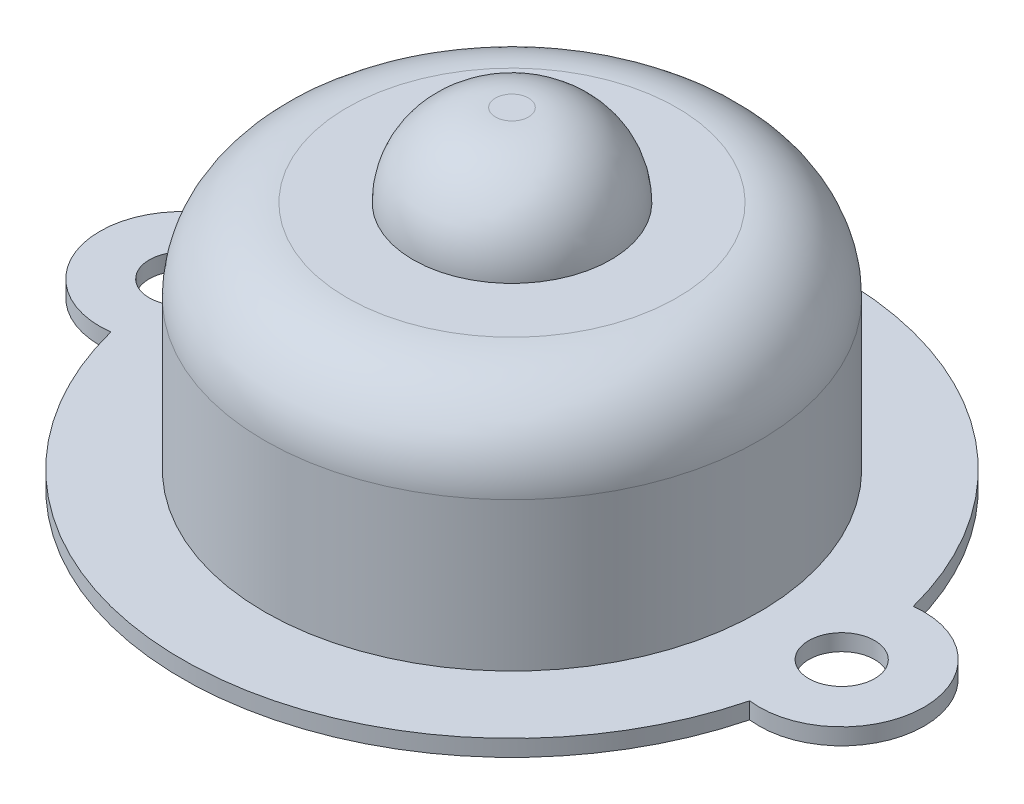
ISO-10303-21;
HEADER;
FILE_DESCRIPTION(('STEP AP214'),'2;1');
FILE_NAME('part.step','',(''),(''),'','','');
FILE_SCHEMA(('AUTOMOTIVE_DESIGN { 1 0 10303 214 1 1 1 1 }'));
ENDSEC;
DATA;
#1=APPLICATION_CONTEXT('core data for automotive mechanical design processes');
#2=APPLICATION_PROTOCOL_DEFINITION('international standard','automotive_design',2000,#1);
#3=PRODUCT_CONTEXT('',#1,'mechanical');
#4=PRODUCT('Part','Part','',(#3));
#5=PRODUCT_RELATED_PRODUCT_CATEGORY('part','',(#4));
#6=PRODUCT_DEFINITION_FORMATION('','',#4);
#7=PRODUCT_DEFINITION_CONTEXT('part definition',#1,'design');
#8=PRODUCT_DEFINITION('design','',#6,#7);
#9=PRODUCT_DEFINITION_SHAPE('','',#8);
#10=(LENGTH_UNIT() NAMED_UNIT(*) SI_UNIT(.MILLI.,.METRE.));
#11=(NAMED_UNIT(*) PLANE_ANGLE_UNIT() SI_UNIT($,.RADIAN.));
#12=(NAMED_UNIT(*) SI_UNIT($,.STERADIAN.) SOLID_ANGLE_UNIT());
#13=UNCERTAINTY_MEASURE_WITH_UNIT(LENGTH_MEASURE(1.E-05),#10,'distance_accuracy_value','');
#14=(GEOMETRIC_REPRESENTATION_CONTEXT(3) GLOBAL_UNCERTAINTY_ASSIGNED_CONTEXT((#13)) GLOBAL_UNIT_ASSIGNED_CONTEXT((#10,
#11,#12)) REPRESENTATION_CONTEXT('',''));
#15=CARTESIAN_POINT('',(0.,0.,0.));
#16=DIRECTION('',(0.,0.,1.));
#17=DIRECTION('',(1.,0.,0.));
#18=AXIS2_PLACEMENT_3D('',#15,#16,#17);
#19=CARTESIAN_POINT('',(0.,15.,0.));
#20=DIRECTION('',(0.,1.,0.));
#21=DIRECTION('',(0.,0.,1.));
#22=AXIS2_PLACEMENT_3D('',#19,#20,#21);
#23=PLANE('',#22);
#24=CARTESIAN_POINT('',(0.,15.,0.));
#25=DIRECTION('',(0.,1.,0.));
#26=DIRECTION('',(0.,0.,1.));
#27=AXIS2_PLACEMENT_3D('',#24,#25,#26);
#28=CIRCLE('',#27,10.);
#29=CARTESIAN_POINT('',(0.,15.,10.));
#30=VERTEX_POINT('',#29);
#31=EDGE_CURVE('E113',#30,#30,#28,.T.);
#32=ORIENTED_EDGE('',*,*,#31,.T.);
#33=EDGE_LOOP('',(#32));
#34=FACE_BOUND('',#33,.T.);
#35=CARTESIAN_POINT('',(0.,15.,0.));
#36=DIRECTION('',(0.,1.,0.));
#37=DIRECTION('',(0.,0.,1.));
#38=AXIS2_PLACEMENT_3D('',#35,#36,#37);
#39=CIRCLE('',#38,6.);
#40=CARTESIAN_POINT('',(0.,15.,6.));
#41=VERTEX_POINT('',#40);
#42=EDGE_CURVE('E132',#41,#41,#39,.T.);
#43=ORIENTED_EDGE('',*,*,#42,.F.);
#44=EDGE_LOOP('',(#43));
#45=FACE_BOUND('',#44,.T.);
#46=ADVANCED_FACE('F34',(#34,#45),#23,.T.);
#47=CARTESIAN_POINT('',(10.,1.,0.));
#48=DIRECTION('',(0.,1.,0.));
#49=DIRECTION('',(0.,0.,1.));
#50=AXIS2_PLACEMENT_3D('',#47,#48,#49);
#51=PLANE('',#50);
#52=CARTESIAN_POINT('',(20.,1.,0.));
#53=DIRECTION('',(0.,1.,0.));
#54=DIRECTION('',(0.,0.,1.));
#55=AXIS2_PLACEMENT_3D('',#52,#53,#54);
#56=CIRCLE('',#55,2.);
#57=CARTESIAN_POINT('',(20.,1.,2.));
#58=VERTEX_POINT('',#57);
#59=EDGE_CURVE('E140',#58,#58,#56,.T.);
#60=ORIENTED_EDGE('',*,*,#59,.F.);
#61=EDGE_LOOP('',(#60));
#62=FACE_BOUND('',#61,.T.);
#63=CARTESIAN_POINT('',(20.,1.,0.));
#64=DIRECTION('',(0.,1.,0.));
#65=DIRECTION('',(0.,0.,1.));
#66=AXIS2_PLACEMENT_3D('',#63,#64,#65);
#67=CIRCLE('',#66,5.);
#68=CARTESIAN_POINT('',(19.375,1.,4.96078370824611));
#69=VERTEX_POINT('',#68);
#70=CARTESIAN_POINT('',(19.375,1.,-4.96078370824611));
#71=VERTEX_POINT('',#70);
#72=EDGE_CURVE('E88',#69,#71,#67,.T.);
#73=ORIENTED_EDGE('',*,*,#72,.T.);
#74=CARTESIAN_POINT('',(0.,1.,0.));
#75=DIRECTION('',(0.,1.,0.));
#76=DIRECTION('',(0.,0.,1.));
#77=AXIS2_PLACEMENT_3D('',#74,#75,#76);
#78=CIRCLE('',#77,20.);
#79=CARTESIAN_POINT('',(-19.375,1.,-4.96078370824611));
#80=VERTEX_POINT('',#79);
#81=EDGE_CURVE('E82',#71,#80,#78,.T.);
#82=ORIENTED_EDGE('',*,*,#81,.T.);
#83=CARTESIAN_POINT('',(-20.,1.,0.));
#84=DIRECTION('',(0.,1.,0.));
#85=DIRECTION('',(0.,0.,1.));
#86=AXIS2_PLACEMENT_3D('',#83,#84,#85);
#87=CIRCLE('',#86,5.);
#88=CARTESIAN_POINT('',(-19.375,1.,4.96078370824611));
#89=VERTEX_POINT('',#88);
#90=EDGE_CURVE('E86',#80,#89,#87,.T.);
#91=ORIENTED_EDGE('',*,*,#90,.T.);
#92=CARTESIAN_POINT('',(0.,1.,0.));
#93=DIRECTION('',(0.,1.,0.));
#94=DIRECTION('',(0.,0.,1.));
#95=AXIS2_PLACEMENT_3D('',#92,#93,#94);
#96=CIRCLE('',#95,20.);
#97=EDGE_CURVE('E51',#89,#69,#96,.T.);
#98=ORIENTED_EDGE('',*,*,#97,.T.);
#99=EDGE_LOOP('',(#73,#82,#91,#98));
#100=FACE_BOUND('',#99,.T.);
#101=CARTESIAN_POINT('',(-20.,1.,0.));
#102=DIRECTION('',(0.,1.,0.));
#103=DIRECTION('',(0.,0.,1.));
#104=AXIS2_PLACEMENT_3D('',#101,#102,#103);
#105=CIRCLE('',#104,2.);
#106=CARTESIAN_POINT('',(-20.,1.,2.));
#107=VERTEX_POINT('',#106);
#108=EDGE_CURVE('E106',#107,#107,#105,.T.);
#109=ORIENTED_EDGE('',*,*,#108,.F.);
#110=EDGE_LOOP('',(#109));
#111=FACE_BOUND('',#110,.T.);
#112=CARTESIAN_POINT('',(0.,1.,0.));
#113=DIRECTION('',(0.,1.,0.));
#114=DIRECTION('',(0.,0.,1.));
#115=AXIS2_PLACEMENT_3D('',#112,#113,#114);
#116=CIRCLE('',#115,15.);
#117=CARTESIAN_POINT('',(0.,1.,15.));
#118=VERTEX_POINT('',#117);
#119=EDGE_CURVE('E134',#118,#118,#116,.T.);
#120=ORIENTED_EDGE('',*,*,#119,.F.);
#121=EDGE_LOOP('',(#120));
#122=FACE_BOUND('',#121,.T.);
#123=ADVANCED_FACE('F83',(#62,#100,#111,#122),#51,.T.);
#124=CARTESIAN_POINT('',(10.,0.,0.));
#125=DIRECTION('',(0.,1.,0.));
#126=DIRECTION('',(0.,0.,1.));
#127=AXIS2_PLACEMENT_3D('',#124,#125,#126);
#128=PLANE('',#127);
#129=CARTESIAN_POINT('',(-20.,0.,0.));
#130=DIRECTION('',(0.,1.,0.));
#131=DIRECTION('',(0.,0.,1.));
#132=AXIS2_PLACEMENT_3D('',#129,#130,#131);
#133=CIRCLE('',#132,2.);
#134=CARTESIAN_POINT('',(-20.,0.,2.));
#135=VERTEX_POINT('',#134);
#136=EDGE_CURVE('E143',#135,#135,#133,.T.);
#137=ORIENTED_EDGE('',*,*,#136,.T.);
#138=EDGE_LOOP('',(#137));
#139=FACE_BOUND('',#138,.T.);
#140=CARTESIAN_POINT('',(20.,0.,0.));
#141=DIRECTION('',(0.,1.,0.));
#142=DIRECTION('',(0.,0.,1.));
#143=AXIS2_PLACEMENT_3D('',#140,#141,#142);
#144=CIRCLE('',#143,5.);
#145=CARTESIAN_POINT('',(19.375,0.,4.96078370824611));
#146=VERTEX_POINT('',#145);
#147=CARTESIAN_POINT('',(19.375,0.,-4.96078370824611));
#148=VERTEX_POINT('',#147);
#149=EDGE_CURVE('E103',#146,#148,#144,.T.);
#150=ORIENTED_EDGE('',*,*,#149,.F.);
#151=CARTESIAN_POINT('',(0.,0.,0.));
#152=DIRECTION('',(0.,1.,0.));
#153=DIRECTION('',(0.,0.,1.));
#154=AXIS2_PLACEMENT_3D('',#151,#152,#153);
#155=CIRCLE('',#154,20.);
#156=CARTESIAN_POINT('',(-19.375,0.,4.96078370824611));
#157=VERTEX_POINT('',#156);
#158=EDGE_CURVE('E74',#157,#146,#155,.T.);
#159=ORIENTED_EDGE('',*,*,#158,.F.);
#160=CARTESIAN_POINT('',(-20.,0.,0.));
#161=DIRECTION('',(0.,1.,0.));
#162=DIRECTION('',(0.,0.,1.));
#163=AXIS2_PLACEMENT_3D('',#160,#161,#162);
#164=CIRCLE('',#163,5.);
#165=CARTESIAN_POINT('',(-19.375,0.,-4.96078370824611));
#166=VERTEX_POINT('',#165);
#167=EDGE_CURVE('E68',#166,#157,#164,.T.);
#168=ORIENTED_EDGE('',*,*,#167,.F.);
#169=CARTESIAN_POINT('',(0.,0.,0.));
#170=DIRECTION('',(0.,1.,0.));
#171=DIRECTION('',(0.,0.,1.));
#172=AXIS2_PLACEMENT_3D('',#169,#170,#171);
#173=CIRCLE('',#172,20.);
#174=EDGE_CURVE('E93',#148,#166,#173,.T.);
#175=ORIENTED_EDGE('',*,*,#174,.F.);
#176=EDGE_LOOP('',(#150,#159,#168,#175));
#177=FACE_BOUND('',#176,.T.);
#178=CARTESIAN_POINT('',(20.,0.,0.));
#179=DIRECTION('',(0.,1.,0.));
#180=DIRECTION('',(0.,0.,1.));
#181=AXIS2_PLACEMENT_3D('',#178,#179,#180);
#182=CIRCLE('',#181,2.);
#183=CARTESIAN_POINT('',(20.,0.,2.));
#184=VERTEX_POINT('',#183);
#185=EDGE_CURVE('E137',#184,#184,#182,.T.);
#186=ORIENTED_EDGE('',*,*,#185,.T.);
#187=EDGE_LOOP('',(#186));
#188=FACE_BOUND('',#187,.T.);
#189=ADVANCED_FACE('F151',(#139,#177,#188),#128,.F.);
#190=CARTESIAN_POINT('',(20.,1.,0.));
#191=DIRECTION('',(0.,-1.,0.));
#192=DIRECTION('',(0.,0.,-1.));
#193=AXIS2_PLACEMENT_3D('',#190,#191,#192);
#194=CYLINDRICAL_SURFACE('',#193,5.);
#195=ORIENTED_EDGE('',*,*,#149,.T.);
#196=DIRECTION('',(0.,-1.,0.));
#197=VECTOR('',#196,1.);
#198=CARTESIAN_POINT('',(19.375,1.,-4.96078370824611));
#199=LINE('',#198,#197);
#200=EDGE_CURVE('E94',#71,#148,#199,.T.);
#201=ORIENTED_EDGE('',*,*,#200,.F.);
#202=ORIENTED_EDGE('',*,*,#72,.F.);
#203=DIRECTION('',(0.,-1.,0.));
#204=VECTOR('',#203,1.);
#205=CARTESIAN_POINT('',(19.375,1.,4.96078370824611));
#206=LINE('',#205,#204);
#207=EDGE_CURVE('E99',#69,#146,#206,.T.);
#208=ORIENTED_EDGE('',*,*,#207,.T.);
#209=EDGE_LOOP('',(#195,#201,#202,#208));
#210=FACE_BOUND('',#209,.T.);
#211=ADVANCED_FACE('F173',(#210),#194,.T.);
#212=CARTESIAN_POINT('',(0.,1.,0.));
#213=DIRECTION('',(0.,-1.,0.));
#214=DIRECTION('',(0.,0.,-1.));
#215=AXIS2_PLACEMENT_3D('',#212,#213,#214);
#216=CYLINDRICAL_SURFACE('',#215,20.);
#217=ORIENTED_EDGE('',*,*,#174,.T.);
#218=DIRECTION('',(0.,-1.,0.));
#219=VECTOR('',#218,1.);
#220=CARTESIAN_POINT('',(-19.375,1.,-4.96078370824611));
#221=LINE('',#220,#219);
#222=EDGE_CURVE('E91',#80,#166,#221,.T.);
#223=ORIENTED_EDGE('',*,*,#222,.F.);
#224=ORIENTED_EDGE('',*,*,#81,.F.);
#225=ORIENTED_EDGE('',*,*,#200,.T.);
#226=EDGE_LOOP('',(#217,#223,#224,#225));
#227=FACE_BOUND('',#226,.T.);
#228=ADVANCED_FACE('F92',(#227),#216,.T.);
#229=CARTESIAN_POINT('',(-20.,1.,0.));
#230=DIRECTION('',(0.,-1.,0.));
#231=DIRECTION('',(0.,0.,-1.));
#232=AXIS2_PLACEMENT_3D('',#229,#230,#231);
#233=CYLINDRICAL_SURFACE('',#232,5.);
#234=ORIENTED_EDGE('',*,*,#167,.T.);
#235=DIRECTION('',(0.,-1.,0.));
#236=VECTOR('',#235,1.);
#237=CARTESIAN_POINT('',(-19.375,1.,4.96078370824611));
#238=LINE('',#237,#236);
#239=EDGE_CURVE('E95',#89,#157,#238,.T.);
#240=ORIENTED_EDGE('',*,*,#239,.F.);
#241=ORIENTED_EDGE('',*,*,#90,.F.);
#242=ORIENTED_EDGE('',*,*,#222,.T.);
#243=EDGE_LOOP('',(#234,#240,#241,#242));
#244=FACE_BOUND('',#243,.T.);
#245=ADVANCED_FACE('F97',(#244),#233,.T.);
#246=CARTESIAN_POINT('',(0.,1.,0.));
#247=DIRECTION('',(0.,-1.,0.));
#248=DIRECTION('',(0.,0.,-1.));
#249=AXIS2_PLACEMENT_3D('',#246,#247,#248);
#250=CYLINDRICAL_SURFACE('',#249,20.);
#251=ORIENTED_EDGE('',*,*,#158,.T.);
#252=ORIENTED_EDGE('',*,*,#207,.F.);
#253=ORIENTED_EDGE('',*,*,#97,.F.);
#254=ORIENTED_EDGE('',*,*,#239,.T.);
#255=EDGE_LOOP('',(#251,#252,#253,#254));
#256=FACE_BOUND('',#255,.T.);
#257=ADVANCED_FACE('F157',(#256),#250,.T.);
#258=CARTESIAN_POINT('',(-20.,1.,0.));
#259=DIRECTION('',(0.,-1.,0.));
#260=DIRECTION('',(0.,0.,-1.));
#261=AXIS2_PLACEMENT_3D('',#258,#259,#260);
#262=CYLINDRICAL_SURFACE('',#261,2.);
#263=ORIENTED_EDGE('',*,*,#108,.T.);
#264=EDGE_LOOP('',(#263));
#265=FACE_BOUND('',#264,.T.);
#266=ORIENTED_EDGE('',*,*,#136,.F.);
#267=EDGE_LOOP('',(#266));
#268=FACE_BOUND('',#267,.T.);
#269=ADVANCED_FACE('F154',(#265,#268),#262,.F.);
#270=CARTESIAN_POINT('',(20.,1.,0.));
#271=DIRECTION('',(0.,-1.,0.));
#272=DIRECTION('',(0.,0.,-1.));
#273=AXIS2_PLACEMENT_3D('',#270,#271,#272);
#274=CYLINDRICAL_SURFACE('',#273,2.);
#275=ORIENTED_EDGE('',*,*,#59,.T.);
#276=EDGE_LOOP('',(#275));
#277=FACE_BOUND('',#276,.T.);
#278=ORIENTED_EDGE('',*,*,#185,.F.);
#279=EDGE_LOOP('',(#278));
#280=FACE_BOUND('',#279,.T.);
#281=ADVANCED_FACE('F156',(#277,#280),#274,.F.);
#282=CARTESIAN_POINT('',(0.,15.,0.));
#283=DIRECTION('',(0.,-1.,0.));
#284=DIRECTION('',(0.,0.,-1.));
#285=AXIS2_PLACEMENT_3D('',#282,#283,#284);
#286=CYLINDRICAL_SURFACE('',#285,15.);
#287=CARTESIAN_POINT('',(0.,10.,0.));
#288=DIRECTION('',(0.,1.,0.));
#289=DIRECTION('',(0.,0.,1.));
#290=AXIS2_PLACEMENT_3D('',#287,#288,#289);
#291=CIRCLE('',#290,15.);
#292=CARTESIAN_POINT('',(0.,10.,15.));
#293=VERTEX_POINT('',#292);
#294=EDGE_CURVE('E43',#293,#293,#291,.F.);
#295=ORIENTED_EDGE('',*,*,#294,.T.);
#296=EDGE_LOOP('',(#295));
#297=FACE_BOUND('',#296,.T.);
#298=ORIENTED_EDGE('',*,*,#119,.T.);
#299=EDGE_LOOP('',(#298));
#300=FACE_BOUND('',#299,.T.);
#301=ADVANCED_FACE('F118',(#297,#300),#286,.T.);
#302=CARTESIAN_POINT('',(0.,10.,0.));
#303=DIRECTION('',(0.,1.,0.));
#304=DIRECTION('',(0.,0.,1.));
#305=AXIS2_PLACEMENT_3D('',#302,#303,#304);
#306=TOROIDAL_SURFACE('',#305,10.,5.);
#307=ORIENTED_EDGE('',*,*,#294,.F.);
#308=EDGE_LOOP('',(#307));
#309=FACE_BOUND('',#308,.T.);
#310=ORIENTED_EDGE('',*,*,#31,.F.);
#311=EDGE_LOOP('',(#310));
#312=FACE_BOUND('',#311,.T.);
#313=ADVANCED_FACE('F121',(#309,#312),#306,.T.);
#314=CARTESIAN_POINT('',(0.,20.,0.));
#315=DIRECTION('',(0.,1.,0.));
#316=DIRECTION('',(0.,0.,1.));
#317=AXIS2_PLACEMENT_3D('',#314,#315,#316);
#318=PLANE('',#317);
#319=CARTESIAN_POINT('',(0.,20.,0.));
#320=DIRECTION('',(0.,1.,0.));
#321=DIRECTION('',(0.,0.,1.));
#322=AXIS2_PLACEMENT_3D('',#319,#320,#321);
#323=CIRCLE('',#322,1.);
#324=CARTESIAN_POINT('',(0.,20.,1.));
#325=VERTEX_POINT('',#324);
#326=EDGE_CURVE('E11',#325,#325,#323,.T.);
#327=ORIENTED_EDGE('',*,*,#326,.T.);
#328=EDGE_LOOP('',(#327));
#329=FACE_BOUND('',#328,.T.);
#330=ADVANCED_FACE('F124',(#329),#318,.T.);
#331=CARTESIAN_POINT('',(0.,15.,0.));
#332=DIRECTION('',(0.,1.,0.));
#333=DIRECTION('',(0.,0.,1.));
#334=AXIS2_PLACEMENT_3D('',#331,#332,#333);
#335=DEGENERATE_TOROIDAL_SURFACE('',#334,1.,5.,.T.);
#336=ORIENTED_EDGE('',*,*,#42,.T.);
#337=EDGE_LOOP('',(#336));
#338=FACE_BOUND('',#337,.T.);
#339=ORIENTED_EDGE('',*,*,#326,.F.);
#340=EDGE_LOOP('',(#339));
#341=FACE_BOUND('',#340,.T.);
#342=ADVANCED_FACE('F36',(#338,#341),#335,.T.);
#343=CLOSED_SHELL('',(#46,#123,#189,#211,#228,#245,#257,#269,#281,#301,#313,#330,#342));
#344=MANIFOLD_SOLID_BREP('B2',#343);
#345=ADVANCED_BREP_SHAPE_REPRESENTATION('',(#18,#344),#14);
#346=SHAPE_DEFINITION_REPRESENTATION(#9,#345);
ENDSEC;
END-ISO-10303-21;
